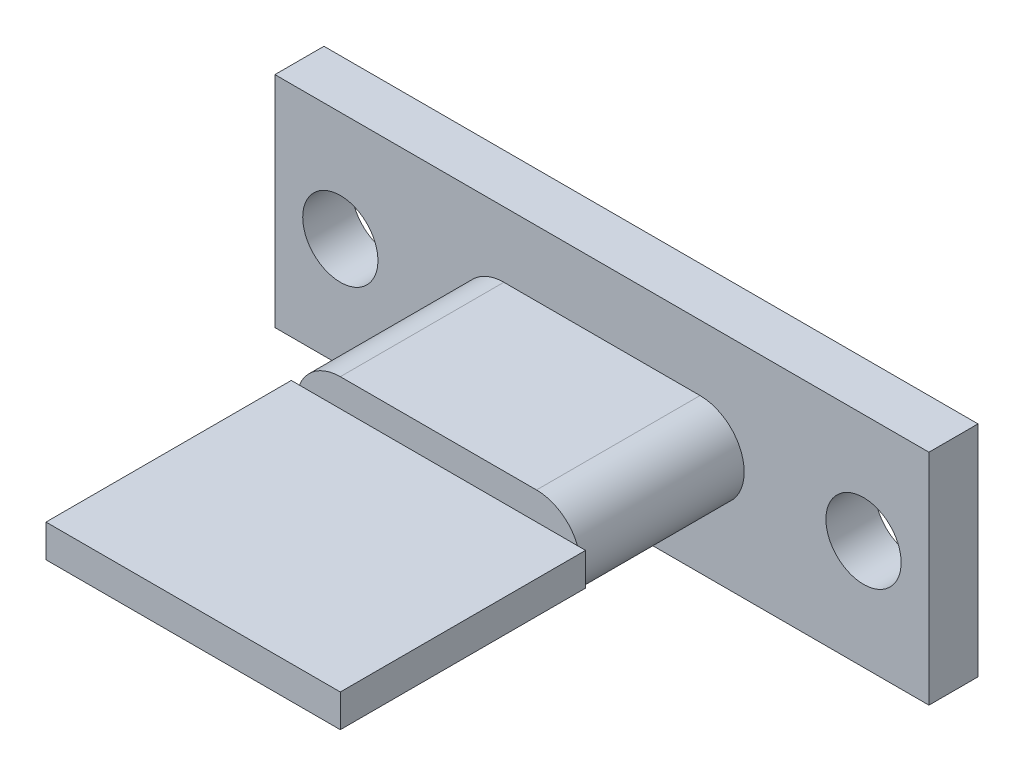
ISO-10303-21;
HEADER;
FILE_DESCRIPTION(('STEP AP214'),'2;1');
FILE_NAME('part.step','',(''),(''),'','','');
FILE_SCHEMA(('AUTOMOTIVE_DESIGN { 1 0 10303 214 1 1 1 1 }'));
ENDSEC;
DATA;
#1=APPLICATION_CONTEXT('core data for automotive mechanical design processes');
#2=APPLICATION_PROTOCOL_DEFINITION('international standard','automotive_design',2000,#1);
#3=PRODUCT_CONTEXT('',#1,'mechanical');
#4=PRODUCT('Part','Part','',(#3));
#5=PRODUCT_RELATED_PRODUCT_CATEGORY('part','',(#4));
#6=PRODUCT_DEFINITION_FORMATION('','',#4);
#7=PRODUCT_DEFINITION_CONTEXT('part definition',#1,'design');
#8=PRODUCT_DEFINITION('design','',#6,#7);
#9=PRODUCT_DEFINITION_SHAPE('','',#8);
#10=(LENGTH_UNIT() NAMED_UNIT(*) SI_UNIT(.MILLI.,.METRE.));
#11=(NAMED_UNIT(*) PLANE_ANGLE_UNIT() SI_UNIT($,.RADIAN.));
#12=(NAMED_UNIT(*) SI_UNIT($,.STERADIAN.) SOLID_ANGLE_UNIT());
#13=UNCERTAINTY_MEASURE_WITH_UNIT(LENGTH_MEASURE(1.E-05),#10,'distance_accuracy_value','');
#14=(GEOMETRIC_REPRESENTATION_CONTEXT(3) GLOBAL_UNCERTAINTY_ASSIGNED_CONTEXT((#13)) GLOBAL_UNIT_ASSIGNED_CONTEXT((#10,
#11,#12)) REPRESENTATION_CONTEXT('',''));
#15=CARTESIAN_POINT('',(0.,0.,0.));
#16=DIRECTION('',(0.,0.,1.));
#17=DIRECTION('',(1.,0.,0.));
#18=AXIS2_PLACEMENT_3D('',#15,#16,#17);
#19=CARTESIAN_POINT('',(3.,0.,6.5));
#20=DIRECTION('',(0.,0.,1.));
#21=DIRECTION('',(1.,0.,0.));
#22=AXIS2_PLACEMENT_3D('',#19,#20,#21);
#23=PLANE('',#22);
#24=DIRECTION('',(1.,0.,0.));
#25=VECTOR('',#24,1.);
#26=CARTESIAN_POINT('',(-4.5,-0.5,6.5));
#27=LINE('',#26,#25);
#28=CARTESIAN_POINT('',(-4.25399362039845,-0.5,6.5));
#29=VERTEX_POINT('',#28);
#30=CARTESIAN_POINT('',(4.25399362039845,-0.5,6.5));
#31=VERTEX_POINT('',#30);
#32=EDGE_CURVE('E12',#29,#31,#27,.T.);
#33=ORIENTED_EDGE('',*,*,#32,.F.);
#34=CARTESIAN_POINT('',(-3.,0.,6.5));
#35=DIRECTION('',(0.,0.,1.));
#36=DIRECTION('',(1.,0.,0.));
#37=AXIS2_PLACEMENT_3D('',#34,#35,#36);
#38=CIRCLE('',#37,1.35);
#39=CARTESIAN_POINT('',(-3.,-1.35,6.5));
#40=VERTEX_POINT('',#39);
#41=EDGE_CURVE('E280',#29,#40,#38,.T.);
#42=ORIENTED_EDGE('',*,*,#41,.T.);
#43=DIRECTION('',(1.,0.,0.));
#44=VECTOR('',#43,1.);
#45=CARTESIAN_POINT('',(-3.,-1.35,6.5));
#46=LINE('',#45,#44);
#47=CARTESIAN_POINT('',(3.,-1.35,6.5));
#48=VERTEX_POINT('',#47);
#49=EDGE_CURVE('E278',#40,#48,#46,.T.);
#50=ORIENTED_EDGE('',*,*,#49,.T.);
#51=CARTESIAN_POINT('',(3.,0.,6.5));
#52=DIRECTION('',(0.,0.,1.));
#53=DIRECTION('',(1.,0.,0.));
#54=AXIS2_PLACEMENT_3D('',#51,#52,#53);
#55=CIRCLE('',#54,1.35);
#56=EDGE_CURVE('E271',#48,#31,#55,.T.);
#57=ORIENTED_EDGE('',*,*,#56,.T.);
#58=EDGE_LOOP('',(#33,#42,#50,#57));
#59=FACE_BOUND('',#58,.T.);
#60=ADVANCED_FACE('F41',(#59),#23,.T.);
#61=CARTESIAN_POINT('',(3.,0.,5.5));
#62=DIRECTION('',(0.,0.,1.));
#63=DIRECTION('',(1.,0.,0.));
#64=AXIS2_PLACEMENT_3D('',#61,#62,#63);
#65=PLANE('',#64);
#66=DIRECTION('',(1.,0.,0.));
#67=VECTOR('',#66,1.);
#68=CARTESIAN_POINT('',(3.,1.25,5.5));
#69=LINE('',#68,#67);
#70=CARTESIAN_POINT('',(-3.,1.25,5.5));
#71=VERTEX_POINT('',#70);
#72=CARTESIAN_POINT('',(3.,1.25,5.5));
#73=VERTEX_POINT('',#72);
#74=EDGE_CURVE('E262',#71,#73,#69,.T.);
#75=ORIENTED_EDGE('',*,*,#74,.T.);
#76=CARTESIAN_POINT('',(3.,0.,5.5));
#77=DIRECTION('',(0.,0.,1.));
#78=DIRECTION('',(1.,0.,0.));
#79=AXIS2_PLACEMENT_3D('',#76,#77,#78);
#80=CIRCLE('',#79,1.25);
#81=CARTESIAN_POINT('',(3.,-1.25,5.5));
#82=VERTEX_POINT('',#81);
#83=EDGE_CURVE('E270',#73,#82,#80,.F.);
#84=ORIENTED_EDGE('',*,*,#83,.T.);
#85=DIRECTION('',(-1.,0.,0.));
#86=VECTOR('',#85,1.);
#87=CARTESIAN_POINT('',(3.,-1.25,5.5));
#88=LINE('',#87,#86);
#89=CARTESIAN_POINT('',(-3.,-1.25,5.5));
#90=VERTEX_POINT('',#89);
#91=EDGE_CURVE('E243',#82,#90,#88,.T.);
#92=ORIENTED_EDGE('',*,*,#91,.T.);
#93=CARTESIAN_POINT('',(-3.,0.,5.5));
#94=DIRECTION('',(0.,0.,1.));
#95=DIRECTION('',(1.,0.,0.));
#96=AXIS2_PLACEMENT_3D('',#93,#94,#95);
#97=CIRCLE('',#96,1.25);
#98=EDGE_CURVE('E261',#90,#71,#97,.F.);
#99=ORIENTED_EDGE('',*,*,#98,.T.);
#100=EDGE_LOOP('',(#75,#84,#92,#99));
#101=FACE_BOUND('',#100,.T.);
#102=DIRECTION('',(0.,1.,0.));
#103=VECTOR('',#102,1.);
#104=CARTESIAN_POINT('',(-3.,-0.3,5.5));
#105=LINE('',#104,#103);
#106=CARTESIAN_POINT('',(-3.,-0.3,5.5));
#107=VERTEX_POINT('',#106);
#108=CARTESIAN_POINT('',(-3.,0.3,5.5));
#109=VERTEX_POINT('',#108);
#110=EDGE_CURVE('E219',#107,#109,#105,.T.);
#111=ORIENTED_EDGE('',*,*,#110,.F.);
#112=DIRECTION('',(-1.,0.,0.));
#113=VECTOR('',#112,1.);
#114=CARTESIAN_POINT('',(3.,-0.3,5.5));
#115=LINE('',#114,#113);
#116=CARTESIAN_POINT('',(3.,-0.3,5.5));
#117=VERTEX_POINT('',#116);
#118=EDGE_CURVE('E229',#117,#107,#115,.T.);
#119=ORIENTED_EDGE('',*,*,#118,.F.);
#120=DIRECTION('',(0.,-1.,0.));
#121=VECTOR('',#120,1.);
#122=CARTESIAN_POINT('',(3.,-0.3,5.5));
#123=LINE('',#122,#121);
#124=CARTESIAN_POINT('',(3.,0.3,5.5));
#125=VERTEX_POINT('',#124);
#126=EDGE_CURVE('E232',#125,#117,#123,.T.);
#127=ORIENTED_EDGE('',*,*,#126,.F.);
#128=DIRECTION('',(1.,0.,0.));
#129=VECTOR('',#128,1.);
#130=CARTESIAN_POINT('',(3.,0.3,5.5));
#131=LINE('',#130,#129);
#132=EDGE_CURVE('E233',#109,#125,#131,.T.);
#133=ORIENTED_EDGE('',*,*,#132,.F.);
#134=EDGE_LOOP('',(#111,#119,#127,#133));
#135=FACE_BOUND('',#134,.T.);
#136=ADVANCED_FACE('F436',(#101,#135),#65,.F.);
#137=CARTESIAN_POINT('',(3.,0.,1.5));
#138=DIRECTION('',(0.,0.,-1.));
#139=DIRECTION('',(-1.,0.,0.));
#140=AXIS2_PLACEMENT_3D('',#137,#138,#139);
#141=CYLINDRICAL_SURFACE('',#140,1.25);
#142=ORIENTED_EDGE('',*,*,#83,.F.);
#143=DIRECTION('',(0.,0.,-1.));
#144=VECTOR('',#143,1.);
#145=CARTESIAN_POINT('',(3.,1.25,1.5));
#146=LINE('',#145,#144);
#147=CARTESIAN_POINT('',(3.,1.25,0.));
#148=VERTEX_POINT('',#147);
#149=EDGE_CURVE('E330',#73,#148,#146,.T.);
#150=ORIENTED_EDGE('',*,*,#149,.T.);
#151=CARTESIAN_POINT('',(3.,0.,0.));
#152=DIRECTION('',(0.,0.,-1.));
#153=DIRECTION('',(-1.,0.,0.));
#154=AXIS2_PLACEMENT_3D('',#151,#152,#153);
#155=CIRCLE('',#154,1.25);
#156=CARTESIAN_POINT('',(3.,-1.25,0.));
#157=VERTEX_POINT('',#156);
#158=EDGE_CURVE('E308',#148,#157,#155,.T.);
#159=ORIENTED_EDGE('',*,*,#158,.T.);
#160=DIRECTION('',(0.,0.,-1.));
#161=VECTOR('',#160,1.);
#162=CARTESIAN_POINT('',(3.,-1.25,1.5));
#163=LINE('',#162,#161);
#164=EDGE_CURVE('E326',#82,#157,#163,.T.);
#165=ORIENTED_EDGE('',*,*,#164,.F.);
#166=EDGE_LOOP('',(#142,#150,#159,#165));
#167=FACE_BOUND('',#166,.T.);
#168=ADVANCED_FACE('F444',(#167),#141,.F.);
#169=CARTESIAN_POINT('',(3.,1.25,1.5));
#170=DIRECTION('',(0.,1.,0.));
#171=DIRECTION('',(0.,0.,1.));
#172=AXIS2_PLACEMENT_3D('',#169,#170,#171);
#173=PLANE('',#172);
#174=ORIENTED_EDGE('',*,*,#74,.F.);
#175=DIRECTION('',(0.,0.,-1.));
#176=VECTOR('',#175,1.);
#177=CARTESIAN_POINT('',(-3.,1.25,1.5));
#178=LINE('',#177,#176);
#179=CARTESIAN_POINT('',(-3.,1.25,0.));
#180=VERTEX_POINT('',#179);
#181=EDGE_CURVE('E329',#71,#180,#178,.T.);
#182=ORIENTED_EDGE('',*,*,#181,.T.);
#183=DIRECTION('',(1.,0.,0.));
#184=VECTOR('',#183,1.);
#185=CARTESIAN_POINT('',(3.,1.25,0.));
#186=LINE('',#185,#184);
#187=EDGE_CURVE('E323',#180,#148,#186,.T.);
#188=ORIENTED_EDGE('',*,*,#187,.T.);
#189=ORIENTED_EDGE('',*,*,#149,.F.);
#190=EDGE_LOOP('',(#174,#182,#188,#189));
#191=FACE_BOUND('',#190,.T.);
#192=ADVANCED_FACE('F463',(#191),#173,.F.);
#193=CARTESIAN_POINT('',(-3.,0.,1.5));
#194=DIRECTION('',(0.,0.,-1.));
#195=DIRECTION('',(-1.,0.,0.));
#196=AXIS2_PLACEMENT_3D('',#193,#194,#195);
#197=CYLINDRICAL_SURFACE('',#196,1.25);
#198=ORIENTED_EDGE('',*,*,#98,.F.);
#199=DIRECTION('',(0.,0.,-1.));
#200=VECTOR('',#199,1.);
#201=CARTESIAN_POINT('',(-3.,-1.25,1.5));
#202=LINE('',#201,#200);
#203=CARTESIAN_POINT('',(-3.,-1.25,0.));
#204=VERTEX_POINT('',#203);
#205=EDGE_CURVE('E335',#90,#204,#202,.T.);
#206=ORIENTED_EDGE('',*,*,#205,.T.);
#207=CARTESIAN_POINT('',(-3.,0.,0.));
#208=DIRECTION('',(0.,0.,-1.));
#209=DIRECTION('',(-1.,0.,0.));
#210=AXIS2_PLACEMENT_3D('',#207,#208,#209);
#211=CIRCLE('',#210,1.25);
#212=EDGE_CURVE('E319',#204,#180,#211,.T.);
#213=ORIENTED_EDGE('',*,*,#212,.T.);
#214=ORIENTED_EDGE('',*,*,#181,.F.);
#215=EDGE_LOOP('',(#198,#206,#213,#214));
#216=FACE_BOUND('',#215,.T.);
#217=ADVANCED_FACE('F427',(#216),#197,.F.);
#218=CARTESIAN_POINT('',(3.,-1.25,1.5));
#219=DIRECTION('',(0.,-1.,0.));
#220=DIRECTION('',(0.,0.,-1.));
#221=AXIS2_PLACEMENT_3D('',#218,#219,#220);
#222=PLANE('',#221);
#223=ORIENTED_EDGE('',*,*,#91,.F.);
#224=ORIENTED_EDGE('',*,*,#164,.T.);
#225=DIRECTION('',(-1.,0.,0.));
#226=VECTOR('',#225,1.);
#227=CARTESIAN_POINT('',(3.,-1.25,0.));
#228=LINE('',#227,#226);
#229=EDGE_CURVE('E320',#157,#204,#228,.T.);
#230=ORIENTED_EDGE('',*,*,#229,.T.);
#231=ORIENTED_EDGE('',*,*,#205,.F.);
#232=EDGE_LOOP('',(#223,#224,#230,#231));
#233=FACE_BOUND('',#232,.T.);
#234=ADVANCED_FACE('F416',(#233),#222,.F.);
#235=CARTESIAN_POINT('',(0.,0.,1.5));
#236=DIRECTION('',(0.,0.,-1.));
#237=DIRECTION('',(-1.,0.,0.));
#238=AXIS2_PLACEMENT_3D('',#235,#236,#237);
#239=PLANE('',#238);
#240=DIRECTION('',(0.,1.,0.));
#241=VECTOR('',#240,1.);
#242=CARTESIAN_POINT('',(10.,-3.35,1.5));
#243=LINE('',#242,#241);
#244=CARTESIAN_POINT('',(10.,-3.35,1.5));
#245=VERTEX_POINT('',#244);
#246=CARTESIAN_POINT('',(10.,3.35,1.5));
#247=VERTEX_POINT('',#246);
#248=EDGE_CURVE('E333',#245,#247,#243,.T.);
#249=ORIENTED_EDGE('',*,*,#248,.T.);
#250=DIRECTION('',(-1.,0.,0.));
#251=VECTOR('',#250,1.);
#252=CARTESIAN_POINT('',(-10.,3.35,1.5));
#253=LINE('',#252,#251);
#254=CARTESIAN_POINT('',(-10.,3.35,1.5));
#255=VERTEX_POINT('',#254);
#256=EDGE_CURVE('E340',#247,#255,#253,.T.);
#257=ORIENTED_EDGE('',*,*,#256,.T.);
#258=DIRECTION('',(0.,-1.,0.));
#259=VECTOR('',#258,1.);
#260=CARTESIAN_POINT('',(-10.,-3.35,1.5));
#261=LINE('',#260,#259);
#262=CARTESIAN_POINT('',(-10.,-3.35,1.5));
#263=VERTEX_POINT('',#262);
#264=EDGE_CURVE('E342',#255,#263,#261,.T.);
#265=ORIENTED_EDGE('',*,*,#264,.T.);
#266=DIRECTION('',(1.,0.,0.));
#267=VECTOR('',#266,1.);
#268=CARTESIAN_POINT('',(-10.,-3.35,1.5));
#269=LINE('',#268,#267);
#270=EDGE_CURVE('E344',#263,#245,#269,.T.);
#271=ORIENTED_EDGE('',*,*,#270,.T.);
#272=EDGE_LOOP('',(#249,#257,#265,#271));
#273=FACE_BOUND('',#272,.T.);
#274=CARTESIAN_POINT('',(8.,0.,1.5));
#275=DIRECTION('',(0.,0.,-1.));
#276=DIRECTION('',(-1.,0.,0.));
#277=AXIS2_PLACEMENT_3D('',#274,#275,#276);
#278=CIRCLE('',#277,1.15);
#279=CARTESIAN_POINT('',(6.85,0.,1.5));
#280=VERTEX_POINT('',#279);
#281=EDGE_CURVE('E307',#280,#280,#278,.T.);
#282=ORIENTED_EDGE('',*,*,#281,.T.);
#283=EDGE_LOOP('',(#282));
#284=FACE_BOUND('',#283,.T.);
#285=CARTESIAN_POINT('',(-8.,0.,1.5));
#286=DIRECTION('',(0.,0.,-1.));
#287=DIRECTION('',(-1.,0.,0.));
#288=AXIS2_PLACEMENT_3D('',#285,#286,#287);
#289=CIRCLE('',#288,1.15);
#290=CARTESIAN_POINT('',(-9.15,0.,1.5));
#291=VERTEX_POINT('',#290);
#292=EDGE_CURVE('E305',#291,#291,#289,.T.);
#293=ORIENTED_EDGE('',*,*,#292,.T.);
#294=EDGE_LOOP('',(#293));
#295=FACE_BOUND('',#294,.T.);
#296=CARTESIAN_POINT('',(3.,0.,1.5));
#297=DIRECTION('',(0.,0.,1.));
#298=DIRECTION('',(1.,0.,0.));
#299=AXIS2_PLACEMENT_3D('',#296,#297,#298);
#300=CIRCLE('',#299,1.35);
#301=CARTESIAN_POINT('',(3.,-1.35,1.5));
#302=VERTEX_POINT('',#301);
#303=CARTESIAN_POINT('',(3.,1.35,1.5));
#304=VERTEX_POINT('',#303);
#305=EDGE_CURVE('E269',#302,#304,#300,.T.);
#306=ORIENTED_EDGE('',*,*,#305,.F.);
#307=DIRECTION('',(1.,0.,0.));
#308=VECTOR('',#307,1.);
#309=CARTESIAN_POINT('',(-3.,-1.35,1.5));
#310=LINE('',#309,#308);
#311=CARTESIAN_POINT('',(-3.,-1.35,1.5));
#312=VERTEX_POINT('',#311);
#313=EDGE_CURVE('E295',#312,#302,#310,.T.);
#314=ORIENTED_EDGE('',*,*,#313,.F.);
#315=CARTESIAN_POINT('',(-3.,0.,1.5));
#316=DIRECTION('',(0.,0.,1.));
#317=DIRECTION('',(1.,0.,0.));
#318=AXIS2_PLACEMENT_3D('',#315,#316,#317);
#319=CIRCLE('',#318,1.35);
#320=CARTESIAN_POINT('',(-3.,1.35,1.5));
#321=VERTEX_POINT('',#320);
#322=EDGE_CURVE('E286',#321,#312,#319,.T.);
#323=ORIENTED_EDGE('',*,*,#322,.F.);
#324=DIRECTION('',(-1.,0.,0.));
#325=VECTOR('',#324,1.);
#326=CARTESIAN_POINT('',(3.,1.35,1.5));
#327=LINE('',#326,#325);
#328=EDGE_CURVE('E287',#304,#321,#327,.T.);
#329=ORIENTED_EDGE('',*,*,#328,.F.);
#330=EDGE_LOOP('',(#306,#314,#323,#329));
#331=FACE_BOUND('',#330,.T.);
#332=ADVANCED_FACE('F418',(#273,#284,#295,#331),#239,.F.);
#333=CARTESIAN_POINT('',(10.,-3.35,1.5));
#334=DIRECTION('',(-1.,0.,0.));
#335=DIRECTION('',(0.,0.,1.));
#336=AXIS2_PLACEMENT_3D('',#333,#334,#335);
#337=PLANE('',#336);
#338=DIRECTION('',(0.,1.,0.));
#339=VECTOR('',#338,1.);
#340=CARTESIAN_POINT('',(10.,-3.35,0.));
#341=LINE('',#340,#339);
#342=CARTESIAN_POINT('',(10.,-3.35,0.));
#343=VERTEX_POINT('',#342);
#344=CARTESIAN_POINT('',(10.,3.35,0.));
#345=VERTEX_POINT('',#344);
#346=EDGE_CURVE('E328',#343,#345,#341,.T.);
#347=ORIENTED_EDGE('',*,*,#346,.T.);
#348=DIRECTION('',(0.,0.,-1.));
#349=VECTOR('',#348,1.);
#350=CARTESIAN_POINT('',(10.,3.35,1.5));
#351=LINE('',#350,#349);
#352=EDGE_CURVE('E44',#247,#345,#351,.T.);
#353=ORIENTED_EDGE('',*,*,#352,.F.);
#354=ORIENTED_EDGE('',*,*,#248,.F.);
#355=DIRECTION('',(0.,0.,-1.));
#356=VECTOR('',#355,1.);
#357=CARTESIAN_POINT('',(10.,-3.35,1.5));
#358=LINE('',#357,#356);
#359=EDGE_CURVE('E343',#245,#343,#358,.T.);
#360=ORIENTED_EDGE('',*,*,#359,.T.);
#361=EDGE_LOOP('',(#347,#353,#354,#360));
#362=FACE_BOUND('',#361,.T.);
#363=ADVANCED_FACE('F43',(#362),#337,.F.);
#364=CARTESIAN_POINT('',(-10.,3.35,1.5));
#365=DIRECTION('',(0.,-1.,0.));
#366=DIRECTION('',(0.,0.,-1.));
#367=AXIS2_PLACEMENT_3D('',#364,#365,#366);
#368=PLANE('',#367);
#369=DIRECTION('',(-1.,0.,0.));
#370=VECTOR('',#369,1.);
#371=CARTESIAN_POINT('',(-10.,3.35,0.));
#372=LINE('',#371,#370);
#373=CARTESIAN_POINT('',(-10.,3.35,0.));
#374=VERTEX_POINT('',#373);
#375=EDGE_CURVE('E346',#345,#374,#372,.T.);
#376=ORIENTED_EDGE('',*,*,#375,.T.);
#377=DIRECTION('',(0.,0.,-1.));
#378=VECTOR('',#377,1.);
#379=CARTESIAN_POINT('',(-10.,3.35,1.5));
#380=LINE('',#379,#378);
#381=EDGE_CURVE('E360',#255,#374,#380,.T.);
#382=ORIENTED_EDGE('',*,*,#381,.F.);
#383=ORIENTED_EDGE('',*,*,#256,.F.);
#384=ORIENTED_EDGE('',*,*,#352,.T.);
#385=EDGE_LOOP('',(#376,#382,#383,#384));
#386=FACE_BOUND('',#385,.T.);
#387=ADVANCED_FACE('F426',(#386),#368,.F.);
#388=CARTESIAN_POINT('',(-10.,-3.35,1.5));
#389=DIRECTION('',(1.,0.,0.));
#390=DIRECTION('',(0.,0.,-1.));
#391=AXIS2_PLACEMENT_3D('',#388,#389,#390);
#392=PLANE('',#391);
#393=DIRECTION('',(0.,-1.,0.));
#394=VECTOR('',#393,1.);
#395=CARTESIAN_POINT('',(-10.,-3.35,0.));
#396=LINE('',#395,#394);
#397=CARTESIAN_POINT('',(-10.,-3.35,0.));
#398=VERTEX_POINT('',#397);
#399=EDGE_CURVE('E348',#374,#398,#396,.T.);
#400=ORIENTED_EDGE('',*,*,#399,.T.);
#401=DIRECTION('',(0.,0.,-1.));
#402=VECTOR('',#401,1.);
#403=CARTESIAN_POINT('',(-10.,-3.35,1.5));
#404=LINE('',#403,#402);
#405=EDGE_CURVE('E352',#263,#398,#404,.T.);
#406=ORIENTED_EDGE('',*,*,#405,.F.);
#407=ORIENTED_EDGE('',*,*,#264,.F.);
#408=ORIENTED_EDGE('',*,*,#381,.T.);
#409=EDGE_LOOP('',(#400,#406,#407,#408));
#410=FACE_BOUND('',#409,.T.);
#411=ADVANCED_FACE('F493',(#410),#392,.F.);
#412=CARTESIAN_POINT('',(-10.,-3.35,1.5));
#413=DIRECTION('',(0.,1.,0.));
#414=DIRECTION('',(0.,0.,1.));
#415=AXIS2_PLACEMENT_3D('',#412,#413,#414);
#416=PLANE('',#415);
#417=DIRECTION('',(1.,0.,0.));
#418=VECTOR('',#417,1.);
#419=CARTESIAN_POINT('',(-10.,-3.35,0.));
#420=LINE('',#419,#418);
#421=EDGE_CURVE('E338',#398,#343,#420,.T.);
#422=ORIENTED_EDGE('',*,*,#421,.T.);
#423=ORIENTED_EDGE('',*,*,#359,.F.);
#424=ORIENTED_EDGE('',*,*,#270,.F.);
#425=ORIENTED_EDGE('',*,*,#405,.T.);
#426=EDGE_LOOP('',(#422,#423,#424,#425));
#427=FACE_BOUND('',#426,.T.);
#428=ADVANCED_FACE('F484',(#427),#416,.F.);
#429=CARTESIAN_POINT('',(0.,0.,0.));
#430=DIRECTION('',(0.,0.,-1.));
#431=DIRECTION('',(-1.,0.,0.));
#432=AXIS2_PLACEMENT_3D('',#429,#430,#431);
#433=PLANE('',#432);
#434=CARTESIAN_POINT('',(-8.,0.,0.));
#435=DIRECTION('',(0.,0.,-1.));
#436=DIRECTION('',(-1.,0.,0.));
#437=AXIS2_PLACEMENT_3D('',#434,#435,#436);
#438=CIRCLE('',#437,1.15);
#439=CARTESIAN_POINT('',(-9.15,0.,0.));
#440=VERTEX_POINT('',#439);
#441=EDGE_CURVE('E309',#440,#440,#438,.T.);
#442=ORIENTED_EDGE('',*,*,#441,.F.);
#443=EDGE_LOOP('',(#442));
#444=FACE_BOUND('',#443,.T.);
#445=CARTESIAN_POINT('',(8.,0.,0.));
#446=DIRECTION('',(0.,0.,-1.));
#447=DIRECTION('',(-1.,0.,0.));
#448=AXIS2_PLACEMENT_3D('',#445,#446,#447);
#449=CIRCLE('',#448,1.15);
#450=CARTESIAN_POINT('',(6.85,0.,0.));
#451=VERTEX_POINT('',#450);
#452=EDGE_CURVE('E304',#451,#451,#449,.T.);
#453=ORIENTED_EDGE('',*,*,#452,.F.);
#454=EDGE_LOOP('',(#453));
#455=FACE_BOUND('',#454,.T.);
#456=ORIENTED_EDGE('',*,*,#158,.F.);
#457=ORIENTED_EDGE('',*,*,#187,.F.);
#458=ORIENTED_EDGE('',*,*,#212,.F.);
#459=ORIENTED_EDGE('',*,*,#229,.F.);
#460=EDGE_LOOP('',(#456,#457,#458,#459));
#461=FACE_BOUND('',#460,.T.);
#462=ORIENTED_EDGE('',*,*,#346,.F.);
#463=ORIENTED_EDGE('',*,*,#421,.F.);
#464=ORIENTED_EDGE('',*,*,#399,.F.);
#465=ORIENTED_EDGE('',*,*,#375,.F.);
#466=EDGE_LOOP('',(#462,#463,#464,#465));
#467=FACE_BOUND('',#466,.T.);
#468=ADVANCED_FACE('F456',(#444,#455,#461,#467),#433,.T.);
#469=CARTESIAN_POINT('',(8.,0.,1.5));
#470=DIRECTION('',(0.,0.,-1.));
#471=DIRECTION('',(-1.,0.,0.));
#472=AXIS2_PLACEMENT_3D('',#469,#470,#471);
#473=CYLINDRICAL_SURFACE('',#472,1.15);
#474=ORIENTED_EDGE('',*,*,#281,.F.);
#475=EDGE_LOOP('',(#474));
#476=FACE_BOUND('',#475,.T.);
#477=ORIENTED_EDGE('',*,*,#452,.T.);
#478=EDGE_LOOP('',(#477));
#479=FACE_BOUND('',#478,.T.);
#480=ADVANCED_FACE('F455',(#476,#479),#473,.F.);
#481=CARTESIAN_POINT('',(-8.,0.,1.5));
#482=DIRECTION('',(0.,0.,-1.));
#483=DIRECTION('',(-1.,0.,0.));
#484=AXIS2_PLACEMENT_3D('',#481,#482,#483);
#485=CYLINDRICAL_SURFACE('',#484,1.15);
#486=ORIENTED_EDGE('',*,*,#292,.F.);
#487=EDGE_LOOP('',(#486));
#488=FACE_BOUND('',#487,.T.);
#489=ORIENTED_EDGE('',*,*,#441,.T.);
#490=EDGE_LOOP('',(#489));
#491=FACE_BOUND('',#490,.T.);
#492=ADVANCED_FACE('F446',(#488,#491),#485,.F.);
#493=DIRECTION('',(-1.,0.,0.));
#494=VECTOR('',#493,1.);
#495=CARTESIAN_POINT('',(-4.5,0.5,6.5));
#496=LINE('',#495,#494);
#497=CARTESIAN_POINT('',(4.25399362039845,0.5,6.5));
#498=VERTEX_POINT('',#497);
#499=CARTESIAN_POINT('',(-4.25399362039845,0.5,6.5));
#500=VERTEX_POINT('',#499);
#501=EDGE_CURVE('E49',#498,#500,#496,.T.);
#502=ORIENTED_EDGE('',*,*,#501,.F.);
#503=CARTESIAN_POINT('',(3.,1.35,6.5));
#504=VERTEX_POINT('',#503);
#505=EDGE_CURVE('E274',#498,#504,#55,.T.);
#506=ORIENTED_EDGE('',*,*,#505,.T.);
#507=DIRECTION('',(-1.,0.,0.));
#508=VECTOR('',#507,1.);
#509=CARTESIAN_POINT('',(3.,1.35,6.5));
#510=LINE('',#509,#508);
#511=CARTESIAN_POINT('',(-3.,1.35,6.5));
#512=VERTEX_POINT('',#511);
#513=EDGE_CURVE('E272',#504,#512,#510,.T.);
#514=ORIENTED_EDGE('',*,*,#513,.T.);
#515=EDGE_CURVE('E279',#512,#500,#38,.T.);
#516=ORIENTED_EDGE('',*,*,#515,.T.);
#517=EDGE_LOOP('',(#502,#506,#514,#516));
#518=FACE_BOUND('',#517,.T.);
#519=ADVANCED_FACE('F408',(#518),#23,.T.);
#520=CARTESIAN_POINT('',(3.,0.,6.5));
#521=DIRECTION('',(0.,0.,-1.));
#522=DIRECTION('',(-1.,0.,0.));
#523=AXIS2_PLACEMENT_3D('',#520,#521,#522);
#524=CYLINDRICAL_SURFACE('',#523,1.35);
#525=DIRECTION('',(0.,0.,-1.));
#526=VECTOR('',#525,1.);
#527=CARTESIAN_POINT('',(3.,-1.35,6.5));
#528=LINE('',#527,#526);
#529=EDGE_CURVE('E285',#48,#302,#528,.T.);
#530=ORIENTED_EDGE('',*,*,#529,.T.);
#531=ORIENTED_EDGE('',*,*,#305,.T.);
#532=DIRECTION('',(0.,0.,-1.));
#533=VECTOR('',#532,1.);
#534=CARTESIAN_POINT('',(3.,1.35,6.5));
#535=LINE('',#534,#533);
#536=EDGE_CURVE('E297',#504,#304,#535,.T.);
#537=ORIENTED_EDGE('',*,*,#536,.F.);
#538=ORIENTED_EDGE('',*,*,#505,.F.);
#539=EDGE_CURVE('E273',#31,#498,#55,.T.);
#540=ORIENTED_EDGE('',*,*,#539,.F.);
#541=ORIENTED_EDGE('',*,*,#56,.F.);
#542=EDGE_LOOP('',(#530,#531,#537,#538,#540,#541));
#543=FACE_BOUND('',#542,.T.);
#544=ADVANCED_FACE('F404',(#543),#524,.T.);
#545=CARTESIAN_POINT('',(3.,1.35,6.5));
#546=DIRECTION('',(0.,-1.,0.));
#547=DIRECTION('',(0.,0.,-1.));
#548=AXIS2_PLACEMENT_3D('',#545,#546,#547);
#549=PLANE('',#548);
#550=ORIENTED_EDGE('',*,*,#536,.T.);
#551=ORIENTED_EDGE('',*,*,#328,.T.);
#552=DIRECTION('',(0.,0.,-1.));
#553=VECTOR('',#552,1.);
#554=CARTESIAN_POINT('',(-3.,1.35,6.5));
#555=LINE('',#554,#553);
#556=EDGE_CURVE('E300',#512,#321,#555,.T.);
#557=ORIENTED_EDGE('',*,*,#556,.F.);
#558=ORIENTED_EDGE('',*,*,#513,.F.);
#559=EDGE_LOOP('',(#550,#551,#557,#558));
#560=FACE_BOUND('',#559,.T.);
#561=ADVANCED_FACE('F414',(#560),#549,.F.);
#562=CARTESIAN_POINT('',(-3.,0.,6.5));
#563=DIRECTION('',(0.,0.,-1.));
#564=DIRECTION('',(-1.,0.,0.));
#565=AXIS2_PLACEMENT_3D('',#562,#563,#564);
#566=CYLINDRICAL_SURFACE('',#565,1.35);
#567=ORIENTED_EDGE('',*,*,#556,.T.);
#568=ORIENTED_EDGE('',*,*,#322,.T.);
#569=DIRECTION('',(0.,0.,-1.));
#570=VECTOR('',#569,1.);
#571=CARTESIAN_POINT('',(-3.,-1.35,6.5));
#572=LINE('',#571,#570);
#573=EDGE_CURVE('E299',#40,#312,#572,.T.);
#574=ORIENTED_EDGE('',*,*,#573,.F.);
#575=ORIENTED_EDGE('',*,*,#41,.F.);
#576=EDGE_CURVE('E284',#500,#29,#38,.T.);
#577=ORIENTED_EDGE('',*,*,#576,.F.);
#578=ORIENTED_EDGE('',*,*,#515,.F.);
#579=EDGE_LOOP('',(#567,#568,#574,#575,#577,#578));
#580=FACE_BOUND('',#579,.T.);
#581=ADVANCED_FACE('F397',(#580),#566,.T.);
#582=CARTESIAN_POINT('',(-3.,-1.35,6.5));
#583=DIRECTION('',(0.,1.,0.));
#584=DIRECTION('',(0.,0.,1.));
#585=AXIS2_PLACEMENT_3D('',#582,#583,#584);
#586=PLANE('',#585);
#587=ORIENTED_EDGE('',*,*,#573,.T.);
#588=ORIENTED_EDGE('',*,*,#313,.T.);
#589=ORIENTED_EDGE('',*,*,#529,.F.);
#590=ORIENTED_EDGE('',*,*,#49,.F.);
#591=EDGE_LOOP('',(#587,#588,#589,#590));
#592=FACE_BOUND('',#591,.T.);
#593=ADVANCED_FACE('F398',(#592),#586,.F.);
#594=CARTESIAN_POINT('',(-3.,-0.3,-6.02992537267253));
#595=DIRECTION('',(1.,0.,0.));
#596=DIRECTION('',(0.,0.,-1.));
#597=AXIS2_PLACEMENT_3D('',#594,#595,#596);
#598=PLANE('',#597);
#599=DIRECTION('',(0.,1.,0.));
#600=VECTOR('',#599,1.);
#601=CARTESIAN_POINT('',(-3.,-0.3,1.));
#602=LINE('',#601,#600);
#603=CARTESIAN_POINT('',(-3.,-0.3,1.));
#604=VERTEX_POINT('',#603);
#605=CARTESIAN_POINT('',(-3.,0.3,0.999999999999998));
#606=VERTEX_POINT('',#605);
#607=EDGE_CURVE('E249',#604,#606,#602,.T.);
#608=ORIENTED_EDGE('',*,*,#607,.F.);
#609=DIRECTION('',(0.,0.,1.));
#610=VECTOR('',#609,1.);
#611=CARTESIAN_POINT('',(-3.,-0.3,-6.02992537267253));
#612=LINE('',#611,#610);
#613=EDGE_CURVE('E220',#604,#107,#612,.T.);
#614=ORIENTED_EDGE('',*,*,#613,.T.);
#615=ORIENTED_EDGE('',*,*,#110,.T.);
#616=DIRECTION('',(0.,0.,1.));
#617=VECTOR('',#616,1.);
#618=CARTESIAN_POINT('',(-3.,0.3,-6.02992537267253));
#619=LINE('',#618,#617);
#620=EDGE_CURVE('E236',#606,#109,#619,.T.);
#621=ORIENTED_EDGE('',*,*,#620,.F.);
#622=EDGE_LOOP('',(#608,#614,#615,#621));
#623=FACE_BOUND('',#622,.T.);
#624=ADVANCED_FACE('F567',(#623),#598,.F.);
#625=CARTESIAN_POINT('',(3.,0.3,-6.02992537267253));
#626=DIRECTION('',(0.,-1.,0.));
#627=DIRECTION('',(0.,0.,-1.));
#628=AXIS2_PLACEMENT_3D('',#625,#626,#627);
#629=PLANE('',#628);
#630=DIRECTION('',(1.,0.,0.));
#631=VECTOR('',#630,1.);
#632=CARTESIAN_POINT('',(3.,0.3,1.));
#633=LINE('',#632,#631);
#634=CARTESIAN_POINT('',(3.,0.3,0.999999999999998));
#635=VERTEX_POINT('',#634);
#636=EDGE_CURVE('E242',#606,#635,#633,.T.);
#637=ORIENTED_EDGE('',*,*,#636,.F.);
#638=ORIENTED_EDGE('',*,*,#620,.T.);
#639=ORIENTED_EDGE('',*,*,#132,.T.);
#640=DIRECTION('',(0.,0.,1.));
#641=VECTOR('',#640,1.);
#642=CARTESIAN_POINT('',(3.,0.3,-6.02992537267253));
#643=LINE('',#642,#641);
#644=EDGE_CURVE('E231',#635,#125,#643,.T.);
#645=ORIENTED_EDGE('',*,*,#644,.F.);
#646=EDGE_LOOP('',(#637,#638,#639,#645));
#647=FACE_BOUND('',#646,.T.);
#648=ADVANCED_FACE('F609',(#647),#629,.F.);
#649=CARTESIAN_POINT('',(3.,-0.3,-6.02992537267253));
#650=DIRECTION('',(-1.,0.,0.));
#651=DIRECTION('',(0.,0.,1.));
#652=AXIS2_PLACEMENT_3D('',#649,#650,#651);
#653=PLANE('',#652);
#654=DIRECTION('',(0.,-1.,0.));
#655=VECTOR('',#654,1.);
#656=CARTESIAN_POINT('',(3.,-0.3,1.));
#657=LINE('',#656,#655);
#658=CARTESIAN_POINT('',(3.,-0.3,0.999999999999998));
#659=VERTEX_POINT('',#658);
#660=EDGE_CURVE('E244',#635,#659,#657,.T.);
#661=ORIENTED_EDGE('',*,*,#660,.F.);
#662=ORIENTED_EDGE('',*,*,#644,.T.);
#663=ORIENTED_EDGE('',*,*,#126,.T.);
#664=DIRECTION('',(0.,0.,1.));
#665=VECTOR('',#664,1.);
#666=CARTESIAN_POINT('',(3.,-0.3,-6.02992537267253));
#667=LINE('',#666,#665);
#668=EDGE_CURVE('E227',#659,#117,#667,.T.);
#669=ORIENTED_EDGE('',*,*,#668,.F.);
#670=EDGE_LOOP('',(#661,#662,#663,#669));
#671=FACE_BOUND('',#670,.T.);
#672=ADVANCED_FACE('F620',(#671),#653,.F.);
#673=CARTESIAN_POINT('',(3.,-0.3,-6.02992537267253));
#674=DIRECTION('',(0.,1.,0.));
#675=DIRECTION('',(0.,0.,1.));
#676=AXIS2_PLACEMENT_3D('',#673,#674,#675);
#677=PLANE('',#676);
#678=DIRECTION('',(-1.,0.,0.));
#679=VECTOR('',#678,1.);
#680=CARTESIAN_POINT('',(3.,-0.3,1.));
#681=LINE('',#680,#679);
#682=EDGE_CURVE('E228',#659,#604,#681,.T.);
#683=ORIENTED_EDGE('',*,*,#682,.F.);
#684=ORIENTED_EDGE('',*,*,#668,.T.);
#685=ORIENTED_EDGE('',*,*,#118,.T.);
#686=ORIENTED_EDGE('',*,*,#613,.F.);
#687=EDGE_LOOP('',(#683,#684,#685,#686));
#688=FACE_BOUND('',#687,.T.);
#689=ADVANCED_FACE('F629',(#688),#677,.F.);
#690=CARTESIAN_POINT('',(0.,0.,1.));
#691=DIRECTION('',(0.,0.,-1.));
#692=DIRECTION('',(-1.,0.,0.));
#693=AXIS2_PLACEMENT_3D('',#690,#691,#692);
#694=PLANE('',#693);
#695=ORIENTED_EDGE('',*,*,#682,.T.);
#696=ORIENTED_EDGE('',*,*,#607,.T.);
#697=ORIENTED_EDGE('',*,*,#636,.T.);
#698=ORIENTED_EDGE('',*,*,#660,.T.);
#699=EDGE_LOOP('',(#695,#696,#697,#698));
#700=FACE_BOUND('',#699,.T.);
#701=ADVANCED_FACE('F633',(#700),#694,.T.);
#702=CARTESIAN_POINT('',(0.,0.,6.5));
#703=DIRECTION('',(0.,0.,-1.));
#704=DIRECTION('',(-1.,0.,0.));
#705=AXIS2_PLACEMENT_3D('',#702,#703,#704);
#706=PLANE('',#705);
#707=CARTESIAN_POINT('',(4.5,-0.5,6.5));
#708=VERTEX_POINT('',#707);
#709=EDGE_CURVE('E52',#31,#708,#27,.T.);
#710=ORIENTED_EDGE('',*,*,#709,.F.);
#711=ORIENTED_EDGE('',*,*,#539,.T.);
#712=CARTESIAN_POINT('',(4.5,0.5,6.5));
#713=VERTEX_POINT('',#712);
#714=EDGE_CURVE('E370',#713,#498,#496,.T.);
#715=ORIENTED_EDGE('',*,*,#714,.F.);
#716=DIRECTION('',(0.,1.,0.));
#717=VECTOR('',#716,1.);
#718=CARTESIAN_POINT('',(4.5,-0.5,6.5));
#719=LINE('',#718,#717);
#720=EDGE_CURVE('E216',#708,#713,#719,.T.);
#721=ORIENTED_EDGE('',*,*,#720,.F.);
#722=EDGE_LOOP('',(#710,#711,#715,#721));
#723=FACE_BOUND('',#722,.T.);
#724=ADVANCED_FACE('F406',(#723),#706,.T.);
#725=CARTESIAN_POINT('',(4.5,-0.5,14.));
#726=DIRECTION('',(-1.,0.,0.));
#727=DIRECTION('',(0.,0.,1.));
#728=AXIS2_PLACEMENT_3D('',#725,#726,#727);
#729=PLANE('',#728);
#730=ORIENTED_EDGE('',*,*,#720,.T.);
#731=DIRECTION('',(0.,0.,-1.));
#732=VECTOR('',#731,1.);
#733=CARTESIAN_POINT('',(4.5,0.5,14.));
#734=LINE('',#733,#732);
#735=CARTESIAN_POINT('',(4.5,0.5,14.));
#736=VERTEX_POINT('',#735);
#737=EDGE_CURVE('E197',#736,#713,#734,.T.);
#738=ORIENTED_EDGE('',*,*,#737,.F.);
#739=DIRECTION('',(0.,1.,0.));
#740=VECTOR('',#739,1.);
#741=CARTESIAN_POINT('',(4.5,-0.5,14.));
#742=LINE('',#741,#740);
#743=CARTESIAN_POINT('',(4.5,-0.5,14.));
#744=VERTEX_POINT('',#743);
#745=EDGE_CURVE('E204',#744,#736,#742,.T.);
#746=ORIENTED_EDGE('',*,*,#745,.F.);
#747=DIRECTION('',(0.,0.,-1.));
#748=VECTOR('',#747,1.);
#749=CARTESIAN_POINT('',(4.5,-0.5,14.));
#750=LINE('',#749,#748);
#751=EDGE_CURVE('E374',#744,#708,#750,.T.);
#752=ORIENTED_EDGE('',*,*,#751,.T.);
#753=EDGE_LOOP('',(#730,#738,#746,#752));
#754=FACE_BOUND('',#753,.T.);
#755=ADVANCED_FACE('F212',(#754),#729,.F.);
#756=CARTESIAN_POINT('',(-4.5,0.5,14.));
#757=DIRECTION('',(0.,-1.,0.));
#758=DIRECTION('',(0.,0.,-1.));
#759=AXIS2_PLACEMENT_3D('',#756,#757,#758);
#760=PLANE('',#759);
#761=ORIENTED_EDGE('',*,*,#714,.T.);
#762=ORIENTED_EDGE('',*,*,#501,.T.);
#763=CARTESIAN_POINT('',(-4.5,0.5,6.5));
#764=VERTEX_POINT('',#763);
#765=EDGE_CURVE('E366',#500,#764,#496,.T.);
#766=ORIENTED_EDGE('',*,*,#765,.T.);
#767=DIRECTION('',(0.,0.,-1.));
#768=VECTOR('',#767,1.);
#769=CARTESIAN_POINT('',(-4.5,0.5,14.));
#770=LINE('',#769,#768);
#771=CARTESIAN_POINT('',(-4.5,0.5,14.));
#772=VERTEX_POINT('',#771);
#773=EDGE_CURVE('E199',#772,#764,#770,.T.);
#774=ORIENTED_EDGE('',*,*,#773,.F.);
#775=DIRECTION('',(-1.,0.,0.));
#776=VECTOR('',#775,1.);
#777=CARTESIAN_POINT('',(-4.5,0.5,14.));
#778=LINE('',#777,#776);
#779=EDGE_CURVE('E195',#736,#772,#778,.T.);
#780=ORIENTED_EDGE('',*,*,#779,.F.);
#781=ORIENTED_EDGE('',*,*,#737,.T.);
#782=EDGE_LOOP('',(#761,#762,#766,#774,#780,#781));
#783=FACE_BOUND('',#782,.T.);
#784=ADVANCED_FACE('F193',(#783),#760,.F.);
#785=CARTESIAN_POINT('',(-4.5,-0.5,14.));
#786=DIRECTION('',(1.,0.,0.));
#787=DIRECTION('',(0.,0.,-1.));
#788=AXIS2_PLACEMENT_3D('',#785,#786,#787);
#789=PLANE('',#788);
#790=DIRECTION('',(0.,-1.,0.));
#791=VECTOR('',#790,1.);
#792=CARTESIAN_POINT('',(-4.5,-0.5,6.5));
#793=LINE('',#792,#791);
#794=CARTESIAN_POINT('',(-4.5,-0.5,6.5));
#795=VERTEX_POINT('',#794);
#796=EDGE_CURVE('E371',#764,#795,#793,.T.);
#797=ORIENTED_EDGE('',*,*,#796,.T.);
#798=DIRECTION('',(0.,0.,-1.));
#799=VECTOR('',#798,1.);
#800=CARTESIAN_POINT('',(-4.5,-0.5,14.));
#801=LINE('',#800,#799);
#802=CARTESIAN_POINT('',(-4.5,-0.5,14.));
#803=VERTEX_POINT('',#802);
#804=EDGE_CURVE('E225',#803,#795,#801,.T.);
#805=ORIENTED_EDGE('',*,*,#804,.F.);
#806=DIRECTION('',(0.,-1.,0.));
#807=VECTOR('',#806,1.);
#808=CARTESIAN_POINT('',(-4.5,-0.5,14.));
#809=LINE('',#808,#807);
#810=EDGE_CURVE('E201',#772,#803,#809,.T.);
#811=ORIENTED_EDGE('',*,*,#810,.F.);
#812=ORIENTED_EDGE('',*,*,#773,.T.);
#813=EDGE_LOOP('',(#797,#805,#811,#812));
#814=FACE_BOUND('',#813,.T.);
#815=ADVANCED_FACE('F377',(#814),#789,.F.);
#816=CARTESIAN_POINT('',(-4.5,-0.5,14.));
#817=DIRECTION('',(0.,1.,0.));
#818=DIRECTION('',(0.,0.,1.));
#819=AXIS2_PLACEMENT_3D('',#816,#817,#818);
#820=PLANE('',#819);
#821=EDGE_CURVE('E55',#795,#29,#27,.T.);
#822=ORIENTED_EDGE('',*,*,#821,.T.);
#823=ORIENTED_EDGE('',*,*,#32,.T.);
#824=ORIENTED_EDGE('',*,*,#709,.T.);
#825=ORIENTED_EDGE('',*,*,#751,.F.);
#826=DIRECTION('',(1.,0.,0.));
#827=VECTOR('',#826,1.);
#828=CARTESIAN_POINT('',(-4.5,-0.5,14.));
#829=LINE('',#828,#827);
#830=EDGE_CURVE('E207',#803,#744,#829,.T.);
#831=ORIENTED_EDGE('',*,*,#830,.F.);
#832=ORIENTED_EDGE('',*,*,#804,.T.);
#833=EDGE_LOOP('',(#822,#823,#824,#825,#831,#832));
#834=FACE_BOUND('',#833,.T.);
#835=ADVANCED_FACE('F383',(#834),#820,.F.);
#836=CARTESIAN_POINT('',(0.,0.,14.));
#837=DIRECTION('',(0.,0.,-1.));
#838=DIRECTION('',(-1.,0.,0.));
#839=AXIS2_PLACEMENT_3D('',#836,#837,#838);
#840=PLANE('',#839);
#841=ORIENTED_EDGE('',*,*,#745,.T.);
#842=ORIENTED_EDGE('',*,*,#779,.T.);
#843=ORIENTED_EDGE('',*,*,#810,.T.);
#844=ORIENTED_EDGE('',*,*,#830,.T.);
#845=EDGE_LOOP('',(#841,#842,#843,#844));
#846=FACE_BOUND('',#845,.T.);
#847=ADVANCED_FACE('F210',(#846),#840,.F.);
#848=ORIENTED_EDGE('',*,*,#765,.F.);
#849=ORIENTED_EDGE('',*,*,#576,.T.);
#850=ORIENTED_EDGE('',*,*,#821,.F.);
#851=ORIENTED_EDGE('',*,*,#796,.F.);
#852=EDGE_LOOP('',(#848,#849,#850,#851));
#853=FACE_BOUND('',#852,.T.);
#854=ADVANCED_FACE('F386',(#853),#706,.T.);
#855=CLOSED_SHELL('',(#60,#136,#168,#192,#217,#234,#332,#363,#387,#411,#428,#468,#480,#492,#519,
#544,#561,#581,#593,#624,#648,#672,#689,#701,#724,#755,#784,#815,#835,#847,#854));
#856=MANIFOLD_SOLID_BREP('B2',#855);
#857=ADVANCED_BREP_SHAPE_REPRESENTATION('',(#18,#856),#14);
#858=SHAPE_DEFINITION_REPRESENTATION(#9,#857);
ENDSEC;
END-ISO-10303-21;
